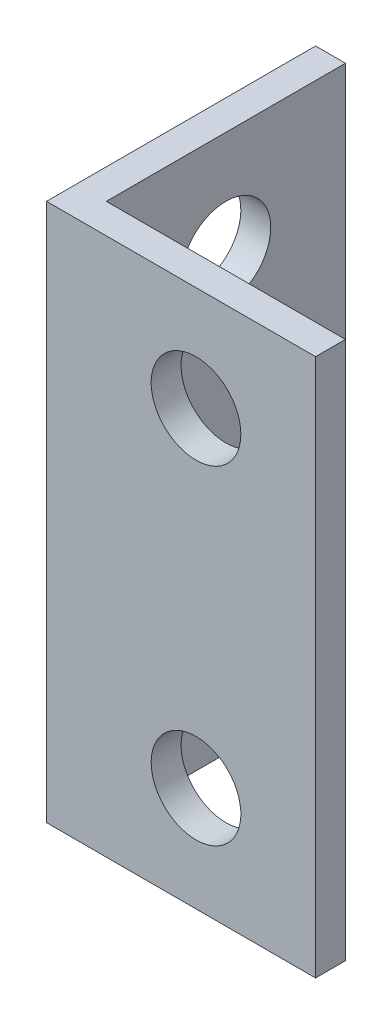
ISO-10303-21;
HEADER;
FILE_DESCRIPTION(('STEP AP214'),'2;1');
FILE_NAME('part.step','',(''),(''),'','','');
FILE_SCHEMA(('AUTOMOTIVE_DESIGN { 1 0 10303 214 1 1 1 1 }'));
ENDSEC;
DATA;
#1=APPLICATION_CONTEXT('core data for automotive mechanical design processes');
#2=APPLICATION_PROTOCOL_DEFINITION('international standard','automotive_design',2000,#1);
#3=PRODUCT_CONTEXT('',#1,'mechanical');
#4=PRODUCT('Part','Part','',(#3));
#5=PRODUCT_RELATED_PRODUCT_CATEGORY('part','',(#4));
#6=PRODUCT_DEFINITION_FORMATION('','',#4);
#7=PRODUCT_DEFINITION_CONTEXT('part definition',#1,'design');
#8=PRODUCT_DEFINITION('design','',#6,#7);
#9=PRODUCT_DEFINITION_SHAPE('','',#8);
#10=(LENGTH_UNIT() NAMED_UNIT(*) SI_UNIT(.MILLI.,.METRE.));
#11=(NAMED_UNIT(*) PLANE_ANGLE_UNIT() SI_UNIT($,.RADIAN.));
#12=(NAMED_UNIT(*) SI_UNIT($,.STERADIAN.) SOLID_ANGLE_UNIT());
#13=UNCERTAINTY_MEASURE_WITH_UNIT(LENGTH_MEASURE(1.E-05),#10,'distance_accuracy_value','');
#14=(GEOMETRIC_REPRESENTATION_CONTEXT(3) GLOBAL_UNCERTAINTY_ASSIGNED_CONTEXT((#13)) GLOBAL_UNIT_ASSIGNED_CONTEXT((#10,
#11,#12)) REPRESENTATION_CONTEXT('',''));
#15=CARTESIAN_POINT('',(0.,0.,0.));
#16=DIRECTION('',(0.,0.,1.));
#17=DIRECTION('',(1.,0.,0.));
#18=AXIS2_PLACEMENT_3D('',#15,#16,#17);
#19=CARTESIAN_POINT('',(-4.,0.,1.));
#20=DIRECTION('',(0.,1.,0.));
#21=DIRECTION('',(-1.,0.,0.));
#22=AXIS2_PLACEMENT_3D('',#19,#20,#21);
#23=PLANE('',#22);
#24=DIRECTION('',(1.,0.,0.));
#25=VECTOR('',#24,1.);
#26=CARTESIAN_POINT('',(-4.,0.,0.));
#27=LINE('',#26,#25);
#28=CARTESIAN_POINT('',(-4.,0.,0.));
#29=VERTEX_POINT('',#28);
#30=CARTESIAN_POINT('',(4.,0.,0.));
#31=VERTEX_POINT('',#30);
#32=EDGE_CURVE('E91',#29,#31,#27,.T.);
#33=ORIENTED_EDGE('',*,*,#32,.T.);
#34=DIRECTION('',(0.,0.,-1.));
#35=VECTOR('',#34,1.);
#36=CARTESIAN_POINT('',(4.,0.,1.));
#37=LINE('',#36,#35);
#38=CARTESIAN_POINT('',(4.,0.,1.));
#39=VERTEX_POINT('',#38);
#40=EDGE_CURVE('E11',#39,#31,#37,.T.);
#41=ORIENTED_EDGE('',*,*,#40,.F.);
#42=DIRECTION('',(1.,0.,0.));
#43=VECTOR('',#42,1.);
#44=CARTESIAN_POINT('',(-4.,0.,1.));
#45=LINE('',#44,#43);
#46=CARTESIAN_POINT('',(-5.,0.,1.));
#47=VERTEX_POINT('',#46);
#48=EDGE_CURVE('E85',#47,#39,#45,.T.);
#49=ORIENTED_EDGE('',*,*,#48,.F.);
#50=DIRECTION('',(0.,0.,1.));
#51=VECTOR('',#50,1.);
#52=CARTESIAN_POINT('',(-5.,0.,-8.));
#53=LINE('',#52,#51);
#54=CARTESIAN_POINT('',(-5.,0.,-8.));
#55=VERTEX_POINT('',#54);
#56=EDGE_CURVE('E109',#55,#47,#53,.T.);
#57=ORIENTED_EDGE('',*,*,#56,.F.);
#58=DIRECTION('',(1.,0.,0.));
#59=VECTOR('',#58,1.);
#60=CARTESIAN_POINT('',(-4.,0.,-8.));
#61=LINE('',#60,#59);
#62=CARTESIAN_POINT('',(-4.,0.,-8.));
#63=VERTEX_POINT('',#62);
#64=EDGE_CURVE('E104',#55,#63,#61,.T.);
#65=ORIENTED_EDGE('',*,*,#64,.T.);
#66=DIRECTION('',(0.,0.,1.));
#67=VECTOR('',#66,1.);
#68=CARTESIAN_POINT('',(-4.,0.,-8.));
#69=LINE('',#68,#67);
#70=EDGE_CURVE('E96',#63,#29,#69,.T.);
#71=ORIENTED_EDGE('',*,*,#70,.T.);
#72=EDGE_LOOP('',(#33,#41,#49,#57,#65,#71));
#73=FACE_BOUND('',#72,.T.);
#74=ADVANCED_FACE('F39',(#73),#23,.F.);
#75=CARTESIAN_POINT('',(4.,18.,1.));
#76=DIRECTION('',(-1.,0.,0.));
#77=DIRECTION('',(0.,-1.,0.));
#78=AXIS2_PLACEMENT_3D('',#75,#76,#77);
#79=PLANE('',#78);
#80=DIRECTION('',(0.,1.,0.));
#81=VECTOR('',#80,1.);
#82=CARTESIAN_POINT('',(4.,18.,0.));
#83=LINE('',#82,#81);
#84=CARTESIAN_POINT('',(4.,18.,0.));
#85=VERTEX_POINT('',#84);
#86=EDGE_CURVE('E68',#31,#85,#83,.T.);
#87=ORIENTED_EDGE('',*,*,#86,.T.);
#88=DIRECTION('',(0.,0.,-1.));
#89=VECTOR('',#88,1.);
#90=CARTESIAN_POINT('',(4.,18.,1.));
#91=LINE('',#90,#89);
#92=CARTESIAN_POINT('',(4.,18.,1.));
#93=VERTEX_POINT('',#92);
#94=EDGE_CURVE('E48',#93,#85,#91,.T.);
#95=ORIENTED_EDGE('',*,*,#94,.F.);
#96=DIRECTION('',(0.,1.,0.));
#97=VECTOR('',#96,1.);
#98=CARTESIAN_POINT('',(4.,18.,1.));
#99=LINE('',#98,#97);
#100=EDGE_CURVE('E56',#39,#93,#99,.T.);
#101=ORIENTED_EDGE('',*,*,#100,.F.);
#102=ORIENTED_EDGE('',*,*,#40,.T.);
#103=EDGE_LOOP('',(#87,#95,#101,#102));
#104=FACE_BOUND('',#103,.T.);
#105=ADVANCED_FACE('F208',(#104),#79,.F.);
#106=CARTESIAN_POINT('',(-4.,18.,1.));
#107=DIRECTION('',(0.,-1.,0.));
#108=DIRECTION('',(0.,0.,-1.));
#109=AXIS2_PLACEMENT_3D('',#106,#107,#108);
#110=PLANE('',#109);
#111=DIRECTION('',(-1.,0.,0.));
#112=VECTOR('',#111,1.);
#113=CARTESIAN_POINT('',(-4.,18.,0.));
#114=LINE('',#113,#112);
#115=CARTESIAN_POINT('',(-4.,18.,0.));
#116=VERTEX_POINT('',#115);
#117=EDGE_CURVE('E74',#85,#116,#114,.T.);
#118=ORIENTED_EDGE('',*,*,#117,.T.);
#119=DIRECTION('',(0.,0.,1.));
#120=VECTOR('',#119,1.);
#121=CARTESIAN_POINT('',(-4.,18.,-8.));
#122=LINE('',#121,#120);
#123=CARTESIAN_POINT('',(-4.,18.,-8.));
#124=VERTEX_POINT('',#123);
#125=EDGE_CURVE('E80',#124,#116,#122,.T.);
#126=ORIENTED_EDGE('',*,*,#125,.F.);
#127=DIRECTION('',(-1.,0.,0.));
#128=VECTOR('',#127,1.);
#129=CARTESIAN_POINT('',(-4.,18.,-8.));
#130=LINE('',#129,#128);
#131=CARTESIAN_POINT('',(-5.,18.,-8.));
#132=VERTEX_POINT('',#131);
#133=EDGE_CURVE('E144',#124,#132,#130,.T.);
#134=ORIENTED_EDGE('',*,*,#133,.T.);
#135=DIRECTION('',(0.,0.,1.));
#136=VECTOR('',#135,1.);
#137=CARTESIAN_POINT('',(-5.,18.,-8.));
#138=LINE('',#137,#136);
#139=CARTESIAN_POINT('',(-5.,18.,1.));
#140=VERTEX_POINT('',#139);
#141=EDGE_CURVE('E103',#132,#140,#138,.T.);
#142=ORIENTED_EDGE('',*,*,#141,.T.);
#143=DIRECTION('',(-1.,0.,0.));
#144=VECTOR('',#143,1.);
#145=CARTESIAN_POINT('',(-4.,18.,1.));
#146=LINE('',#145,#144);
#147=EDGE_CURVE('E120',#93,#140,#146,.T.);
#148=ORIENTED_EDGE('',*,*,#147,.F.);
#149=ORIENTED_EDGE('',*,*,#94,.T.);
#150=EDGE_LOOP('',(#118,#126,#134,#142,#148,#149));
#151=FACE_BOUND('',#150,.T.);
#152=ADVANCED_FACE('F76',(#151),#110,.F.);
#153=CARTESIAN_POINT('',(0.,0.,1.));
#154=DIRECTION('',(0.,0.,1.));
#155=DIRECTION('',(1.,0.,0.));
#156=AXIS2_PLACEMENT_3D('',#153,#154,#155);
#157=PLANE('',#156);
#158=CARTESIAN_POINT('',(0.,3.5,1.));
#159=DIRECTION('',(0.,0.,-1.));
#160=DIRECTION('',(-1.,0.,0.));
#161=AXIS2_PLACEMENT_3D('',#158,#159,#160);
#162=CIRCLE('',#161,1.5);
#163=CARTESIAN_POINT('',(-1.5,3.5,1.));
#164=VERTEX_POINT('',#163);
#165=EDGE_CURVE('E154',#164,#164,#162,.T.);
#166=ORIENTED_EDGE('',*,*,#165,.T.);
#167=EDGE_LOOP('',(#166));
#168=FACE_BOUND('',#167,.T.);
#169=CARTESIAN_POINT('',(0.,14.5,1.));
#170=DIRECTION('',(0.,0.,-1.));
#171=DIRECTION('',(1.,0.,0.));
#172=AXIS2_PLACEMENT_3D('',#169,#170,#171);
#173=CIRCLE('',#172,1.5);
#174=CARTESIAN_POINT('',(1.5,14.5,1.));
#175=VERTEX_POINT('',#174);
#176=EDGE_CURVE('E169',#175,#175,#173,.T.);
#177=ORIENTED_EDGE('',*,*,#176,.T.);
#178=EDGE_LOOP('',(#177));
#179=FACE_BOUND('',#178,.T.);
#180=ORIENTED_EDGE('',*,*,#147,.T.);
#181=DIRECTION('',(0.,-1.,0.));
#182=VECTOR('',#181,1.);
#183=CARTESIAN_POINT('',(-5.,18.,1.));
#184=LINE('',#183,#182);
#185=EDGE_CURVE('E138',#140,#47,#184,.T.);
#186=ORIENTED_EDGE('',*,*,#185,.T.);
#187=ORIENTED_EDGE('',*,*,#48,.T.);
#188=ORIENTED_EDGE('',*,*,#100,.T.);
#189=EDGE_LOOP('',(#180,#186,#187,#188));
#190=FACE_BOUND('',#189,.T.);
#191=ADVANCED_FACE('F181',(#168,#179,#190),#157,.T.);
#192=CARTESIAN_POINT('',(0.,0.,0.));
#193=DIRECTION('',(0.,0.,1.));
#194=DIRECTION('',(1.,0.,0.));
#195=AXIS2_PLACEMENT_3D('',#192,#193,#194);
#196=PLANE('',#195);
#197=CARTESIAN_POINT('',(0.,3.5,0.));
#198=DIRECTION('',(0.,0.,-1.));
#199=DIRECTION('',(-1.,0.,0.));
#200=AXIS2_PLACEMENT_3D('',#197,#198,#199);
#201=CIRCLE('',#200,1.5);
#202=CARTESIAN_POINT('',(-1.5,3.5,0.));
#203=VERTEX_POINT('',#202);
#204=EDGE_CURVE('E173',#203,#203,#201,.T.);
#205=ORIENTED_EDGE('',*,*,#204,.F.);
#206=EDGE_LOOP('',(#205));
#207=FACE_BOUND('',#206,.T.);
#208=CARTESIAN_POINT('',(0.,14.5,0.));
#209=DIRECTION('',(0.,0.,-1.));
#210=DIRECTION('',(1.,0.,0.));
#211=AXIS2_PLACEMENT_3D('',#208,#209,#210);
#212=CIRCLE('',#211,1.5);
#213=CARTESIAN_POINT('',(1.5,14.5,0.));
#214=VERTEX_POINT('',#213);
#215=EDGE_CURVE('E165',#214,#214,#212,.T.);
#216=ORIENTED_EDGE('',*,*,#215,.F.);
#217=EDGE_LOOP('',(#216));
#218=FACE_BOUND('',#217,.T.);
#219=DIRECTION('',(0.,-1.,0.));
#220=VECTOR('',#219,1.);
#221=CARTESIAN_POINT('',(-4.,18.,0.));
#222=LINE('',#221,#220);
#223=EDGE_CURVE('E89',#116,#29,#222,.T.);
#224=ORIENTED_EDGE('',*,*,#223,.F.);
#225=ORIENTED_EDGE('',*,*,#117,.F.);
#226=ORIENTED_EDGE('',*,*,#86,.F.);
#227=ORIENTED_EDGE('',*,*,#32,.F.);
#228=EDGE_LOOP('',(#224,#225,#226,#227));
#229=FACE_BOUND('',#228,.T.);
#230=ADVANCED_FACE('F90',(#207,#218,#229),#196,.F.);
#231=CARTESIAN_POINT('',(-4.,18.,-8.));
#232=DIRECTION('',(1.,0.,0.));
#233=DIRECTION('',(0.,1.,0.));
#234=AXIS2_PLACEMENT_3D('',#231,#232,#233);
#235=PLANE('',#234);
#236=CARTESIAN_POINT('',(-4.,14.5,-4.));
#237=DIRECTION('',(1.,0.,0.));
#238=DIRECTION('',(0.,1.,0.));
#239=AXIS2_PLACEMENT_3D('',#236,#237,#238);
#240=CIRCLE('',#239,1.5);
#241=CARTESIAN_POINT('',(-4.,16.,-4.));
#242=VERTEX_POINT('',#241);
#243=EDGE_CURVE('E158',#242,#242,#240,.T.);
#244=ORIENTED_EDGE('',*,*,#243,.F.);
#245=EDGE_LOOP('',(#244));
#246=FACE_BOUND('',#245,.T.);
#247=CARTESIAN_POINT('',(-4.,3.5,-4.));
#248=DIRECTION('',(1.,0.,0.));
#249=DIRECTION('',(0.,-1.,0.));
#250=AXIS2_PLACEMENT_3D('',#247,#248,#249);
#251=CIRCLE('',#250,1.5);
#252=CARTESIAN_POINT('',(-4.,2.,-4.));
#253=VERTEX_POINT('',#252);
#254=EDGE_CURVE('E149',#253,#253,#251,.T.);
#255=ORIENTED_EDGE('',*,*,#254,.F.);
#256=EDGE_LOOP('',(#255));
#257=FACE_BOUND('',#256,.T.);
#258=ORIENTED_EDGE('',*,*,#125,.T.);
#259=ORIENTED_EDGE('',*,*,#223,.T.);
#260=ORIENTED_EDGE('',*,*,#70,.F.);
#261=DIRECTION('',(0.,1.,0.));
#262=VECTOR('',#261,1.);
#263=CARTESIAN_POINT('',(-4.,18.,-8.));
#264=LINE('',#263,#262);
#265=EDGE_CURVE('E101',#63,#124,#264,.T.);
#266=ORIENTED_EDGE('',*,*,#265,.T.);
#267=EDGE_LOOP('',(#258,#259,#260,#266));
#268=FACE_BOUND('',#267,.T.);
#269=ADVANCED_FACE('F99',(#246,#257,#268),#235,.T.);
#270=CARTESIAN_POINT('',(-5.,18.,-8.));
#271=DIRECTION('',(-1.,0.,0.));
#272=DIRECTION('',(0.,-1.,0.));
#273=AXIS2_PLACEMENT_3D('',#270,#271,#272);
#274=PLANE('',#273);
#275=CARTESIAN_POINT('',(-5.,14.5,-4.));
#276=DIRECTION('',(1.,0.,0.));
#277=DIRECTION('',(0.,1.,0.));
#278=AXIS2_PLACEMENT_3D('',#275,#276,#277);
#279=CIRCLE('',#278,1.5);
#280=CARTESIAN_POINT('',(-5.,16.,-4.));
#281=VERTEX_POINT('',#280);
#282=EDGE_CURVE('E140',#281,#281,#279,.T.);
#283=ORIENTED_EDGE('',*,*,#282,.T.);
#284=EDGE_LOOP('',(#283));
#285=FACE_BOUND('',#284,.T.);
#286=CARTESIAN_POINT('',(-5.,3.5,-4.));
#287=DIRECTION('',(1.,0.,0.));
#288=DIRECTION('',(0.,-1.,0.));
#289=AXIS2_PLACEMENT_3D('',#286,#287,#288);
#290=CIRCLE('',#289,1.5);
#291=CARTESIAN_POINT('',(-5.,2.,-4.));
#292=VERTEX_POINT('',#291);
#293=EDGE_CURVE('E153',#292,#292,#290,.T.);
#294=ORIENTED_EDGE('',*,*,#293,.T.);
#295=EDGE_LOOP('',(#294));
#296=FACE_BOUND('',#295,.T.);
#297=ORIENTED_EDGE('',*,*,#185,.F.);
#298=ORIENTED_EDGE('',*,*,#141,.F.);
#299=DIRECTION('',(0.,-1.,0.));
#300=VECTOR('',#299,1.);
#301=CARTESIAN_POINT('',(-5.,18.,-8.));
#302=LINE('',#301,#300);
#303=EDGE_CURVE('E112',#132,#55,#302,.T.);
#304=ORIENTED_EDGE('',*,*,#303,.T.);
#305=ORIENTED_EDGE('',*,*,#56,.T.);
#306=EDGE_LOOP('',(#297,#298,#304,#305));
#307=FACE_BOUND('',#306,.T.);
#308=ADVANCED_FACE('F227',(#285,#296,#307),#274,.T.);
#309=CARTESIAN_POINT('',(0.,0.,-8.));
#310=DIRECTION('',(0.,0.,-1.));
#311=DIRECTION('',(-1.,0.,0.));
#312=AXIS2_PLACEMENT_3D('',#309,#310,#311);
#313=PLANE('',#312);
#314=ORIENTED_EDGE('',*,*,#265,.F.);
#315=ORIENTED_EDGE('',*,*,#64,.F.);
#316=ORIENTED_EDGE('',*,*,#303,.F.);
#317=ORIENTED_EDGE('',*,*,#133,.F.);
#318=EDGE_LOOP('',(#314,#315,#316,#317));
#319=FACE_BOUND('',#318,.T.);
#320=ADVANCED_FACE('F230',(#319),#313,.T.);
#321=CARTESIAN_POINT('',(-5.,3.5,-4.));
#322=DIRECTION('',(1.,0.,0.));
#323=DIRECTION('',(0.,1.,0.));
#324=AXIS2_PLACEMENT_3D('',#321,#322,#323);
#325=CYLINDRICAL_SURFACE('',#324,1.5);
#326=ORIENTED_EDGE('',*,*,#293,.F.);
#327=EDGE_LOOP('',(#326));
#328=FACE_BOUND('',#327,.T.);
#329=ORIENTED_EDGE('',*,*,#254,.T.);
#330=EDGE_LOOP('',(#329));
#331=FACE_BOUND('',#330,.T.);
#332=ADVANCED_FACE('F203',(#328,#331),#325,.F.);
#333=CARTESIAN_POINT('',(-5.,14.5,-4.));
#334=DIRECTION('',(1.,0.,0.));
#335=DIRECTION('',(0.,1.,0.));
#336=AXIS2_PLACEMENT_3D('',#333,#334,#335);
#337=CYLINDRICAL_SURFACE('',#336,1.5);
#338=ORIENTED_EDGE('',*,*,#282,.F.);
#339=EDGE_LOOP('',(#338));
#340=FACE_BOUND('',#339,.T.);
#341=ORIENTED_EDGE('',*,*,#243,.T.);
#342=EDGE_LOOP('',(#341));
#343=FACE_BOUND('',#342,.T.);
#344=ADVANCED_FACE('F197',(#340,#343),#337,.F.);
#345=CARTESIAN_POINT('',(0.,14.5,1.));
#346=DIRECTION('',(0.,0.,-1.));
#347=DIRECTION('',(-1.,0.,0.));
#348=AXIS2_PLACEMENT_3D('',#345,#346,#347);
#349=CYLINDRICAL_SURFACE('',#348,1.5);
#350=ORIENTED_EDGE('',*,*,#176,.F.);
#351=EDGE_LOOP('',(#350));
#352=FACE_BOUND('',#351,.T.);
#353=ORIENTED_EDGE('',*,*,#215,.T.);
#354=EDGE_LOOP('',(#353));
#355=FACE_BOUND('',#354,.T.);
#356=ADVANCED_FACE('F187',(#352,#355),#349,.F.);
#357=CARTESIAN_POINT('',(0.,3.5,1.));
#358=DIRECTION('',(0.,0.,-1.));
#359=DIRECTION('',(-1.,0.,0.));
#360=AXIS2_PLACEMENT_3D('',#357,#358,#359);
#361=CYLINDRICAL_SURFACE('',#360,1.5);
#362=ORIENTED_EDGE('',*,*,#165,.F.);
#363=EDGE_LOOP('',(#362));
#364=FACE_BOUND('',#363,.T.);
#365=ORIENTED_EDGE('',*,*,#204,.T.);
#366=EDGE_LOOP('',(#365));
#367=FACE_BOUND('',#366,.T.);
#368=ADVANCED_FACE('F184',(#364,#367),#361,.F.);
#369=CLOSED_SHELL('',(#74,#105,#152,#191,#230,#269,#308,#320,#332,#344,#356,#368));
#370=MANIFOLD_SOLID_BREP('B2',#369);
#371=ADVANCED_BREP_SHAPE_REPRESENTATION('',(#18,#370),#14);
#372=SHAPE_DEFINITION_REPRESENTATION(#9,#371);
ENDSEC;
END-ISO-10303-21;
